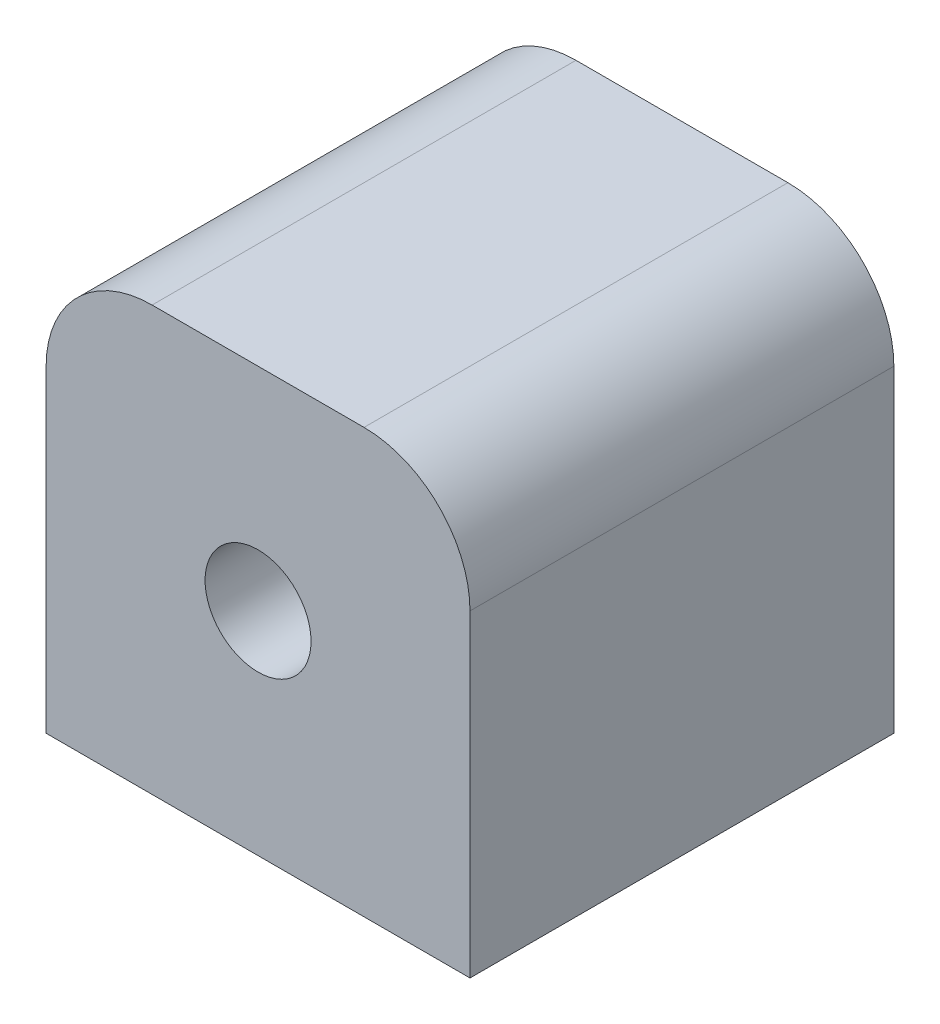
ISO-10303-21;
HEADER;
FILE_DESCRIPTION(('STEP AP214'),'2;1');
FILE_NAME('part.step','',(''),(''),'','','');
FILE_SCHEMA(('AUTOMOTIVE_DESIGN { 1 0 10303 214 1 1 1 1 }'));
ENDSEC;
DATA;
#1=APPLICATION_CONTEXT('core data for automotive mechanical design processes');
#2=APPLICATION_PROTOCOL_DEFINITION('international standard','automotive_design',2000,#1);
#3=PRODUCT_CONTEXT('',#1,'mechanical');
#4=PRODUCT('Part','Part','',(#3));
#5=PRODUCT_RELATED_PRODUCT_CATEGORY('part','',(#4));
#6=PRODUCT_DEFINITION_FORMATION('','',#4);
#7=PRODUCT_DEFINITION_CONTEXT('part definition',#1,'design');
#8=PRODUCT_DEFINITION('design','',#6,#7);
#9=PRODUCT_DEFINITION_SHAPE('','',#8);
#10=(LENGTH_UNIT() NAMED_UNIT(*) SI_UNIT(.MILLI.,.METRE.));
#11=(NAMED_UNIT(*) PLANE_ANGLE_UNIT() SI_UNIT($,.RADIAN.));
#12=(NAMED_UNIT(*) SI_UNIT($,.STERADIAN.) SOLID_ANGLE_UNIT());
#13=UNCERTAINTY_MEASURE_WITH_UNIT(LENGTH_MEASURE(1.E-05),#10,'distance_accuracy_value','');
#14=(GEOMETRIC_REPRESENTATION_CONTEXT(3) GLOBAL_UNCERTAINTY_ASSIGNED_CONTEXT((#13)) GLOBAL_UNIT_ASSIGNED_CONTEXT((#10,
#11,#12)) REPRESENTATION_CONTEXT('',''));
#15=CARTESIAN_POINT('',(0.,0.,0.));
#16=DIRECTION('',(0.,0.,1.));
#17=DIRECTION('',(1.,0.,0.));
#18=AXIS2_PLACEMENT_3D('',#15,#16,#17);
#19=CARTESIAN_POINT('',(20.,40.,-20.));
#20=DIRECTION('',(-1.,0.,0.));
#21=DIRECTION('',(0.,0.,1.));
#22=AXIS2_PLACEMENT_3D('',#19,#20,#21);
#23=PLANE('',#22);
#24=DIRECTION('',(0.,-1.,0.));
#25=VECTOR('',#24,1.);
#26=CARTESIAN_POINT('',(20.,40.,-20.));
#27=LINE('',#26,#25);
#28=CARTESIAN_POINT('',(20.,30.,-20.));
#29=VERTEX_POINT('',#28);
#30=CARTESIAN_POINT('',(20.,0.,-20.));
#31=VERTEX_POINT('',#30);
#32=EDGE_CURVE('E184',#29,#31,#27,.T.);
#33=ORIENTED_EDGE('',*,*,#32,.F.);
#34=DIRECTION('',(0.,0.,-1.));
#35=VECTOR('',#34,1.);
#36=CARTESIAN_POINT('',(20.,30.,20.));
#37=LINE('',#36,#35);
#38=CARTESIAN_POINT('',(20.,30.,20.));
#39=VERTEX_POINT('',#38);
#40=EDGE_CURVE('E11',#29,#39,#37,.F.);
#41=ORIENTED_EDGE('',*,*,#40,.T.);
#42=DIRECTION('',(0.,-1.,0.));
#43=VECTOR('',#42,1.);
#44=CARTESIAN_POINT('',(20.,40.,20.));
#45=LINE('',#44,#43);
#46=CARTESIAN_POINT('',(20.,0.,20.));
#47=VERTEX_POINT('',#46);
#48=EDGE_CURVE('E168',#39,#47,#45,.T.);
#49=ORIENTED_EDGE('',*,*,#48,.T.);
#50=DIRECTION('',(0.,0.,-1.));
#51=VECTOR('',#50,1.);
#52=CARTESIAN_POINT('',(20.,0.,-20.));
#53=LINE('',#52,#51);
#54=EDGE_CURVE('E158',#47,#31,#53,.T.);
#55=ORIENTED_EDGE('',*,*,#54,.T.);
#56=EDGE_LOOP('',(#33,#41,#49,#55));
#57=FACE_BOUND('',#56,.T.);
#58=ADVANCED_FACE('F47',(#57),#23,.F.);
#59=CARTESIAN_POINT('',(-20.,40.,-20.));
#60=DIRECTION('',(0.,0.,1.));
#61=DIRECTION('',(1.,0.,0.));
#62=AXIS2_PLACEMENT_3D('',#59,#60,#61);
#63=PLANE('',#62);
#64=CARTESIAN_POINT('',(0.,20.,-20.));
#65=DIRECTION('',(0.,0.,1.));
#66=DIRECTION('',(1.,0.,0.));
#67=AXIS2_PLACEMENT_3D('',#64,#65,#66);
#68=CIRCLE('',#67,5.);
#69=CARTESIAN_POINT('',(5.,20.,-20.));
#70=VERTEX_POINT('',#69);
#71=EDGE_CURVE('E155',#70,#70,#68,.T.);
#72=ORIENTED_EDGE('',*,*,#71,.T.);
#73=EDGE_LOOP('',(#72));
#74=FACE_BOUND('',#73,.T.);
#75=DIRECTION('',(0.,-1.,0.));
#76=VECTOR('',#75,1.);
#77=CARTESIAN_POINT('',(-20.,40.,-20.));
#78=LINE('',#77,#76);
#79=CARTESIAN_POINT('',(-20.,30.,-20.));
#80=VERTEX_POINT('',#79);
#81=CARTESIAN_POINT('',(-20.,0.,-20.));
#82=VERTEX_POINT('',#81);
#83=EDGE_CURVE('E182',#80,#82,#78,.T.);
#84=ORIENTED_EDGE('',*,*,#83,.F.);
#85=CARTESIAN_POINT('',(-10.,30.,-20.));
#86=DIRECTION('',(0.,0.,1.));
#87=DIRECTION('',(1.,0.,0.));
#88=AXIS2_PLACEMENT_3D('',#85,#86,#87);
#89=CIRCLE('',#88,10.);
#90=CARTESIAN_POINT('',(-10.,40.,-20.));
#91=VERTEX_POINT('',#90);
#92=EDGE_CURVE('E55',#80,#91,#89,.F.);
#93=ORIENTED_EDGE('',*,*,#92,.T.);
#94=DIRECTION('',(-1.,0.,0.));
#95=VECTOR('',#94,1.);
#96=CARTESIAN_POINT('',(-20.,40.,-20.));
#97=LINE('',#96,#95);
#98=CARTESIAN_POINT('',(10.,40.,-20.));
#99=VERTEX_POINT('',#98);
#100=EDGE_CURVE('E161',#99,#91,#97,.T.);
#101=ORIENTED_EDGE('',*,*,#100,.F.);
#102=CARTESIAN_POINT('',(10.,30.,-20.));
#103=DIRECTION('',(0.,0.,1.));
#104=DIRECTION('',(1.,0.,0.));
#105=AXIS2_PLACEMENT_3D('',#102,#103,#104);
#106=CIRCLE('',#105,10.);
#107=EDGE_CURVE('E62',#99,#29,#106,.F.);
#108=ORIENTED_EDGE('',*,*,#107,.T.);
#109=ORIENTED_EDGE('',*,*,#32,.T.);
#110=DIRECTION('',(-1.,0.,0.));
#111=VECTOR('',#110,1.);
#112=CARTESIAN_POINT('',(-20.,0.,-20.));
#113=LINE('',#112,#111);
#114=EDGE_CURVE('E171',#31,#82,#113,.T.);
#115=ORIENTED_EDGE('',*,*,#114,.T.);
#116=EDGE_LOOP('',(#84,#93,#101,#108,#109,#115));
#117=FACE_BOUND('',#116,.T.);
#118=ADVANCED_FACE('F198',(#74,#117),#63,.F.);
#119=CARTESIAN_POINT('',(-20.,40.,-20.));
#120=DIRECTION('',(1.,0.,0.));
#121=DIRECTION('',(0.,0.,-1.));
#122=AXIS2_PLACEMENT_3D('',#119,#120,#121);
#123=PLANE('',#122);
#124=DIRECTION('',(0.,-1.,0.));
#125=VECTOR('',#124,1.);
#126=CARTESIAN_POINT('',(-20.,40.,20.));
#127=LINE('',#126,#125);
#128=CARTESIAN_POINT('',(-20.,30.,20.));
#129=VERTEX_POINT('',#128);
#130=CARTESIAN_POINT('',(-20.,0.,20.));
#131=VERTEX_POINT('',#130);
#132=EDGE_CURVE('E180',#129,#131,#127,.T.);
#133=ORIENTED_EDGE('',*,*,#132,.F.);
#134=DIRECTION('',(0.,0.,1.));
#135=VECTOR('',#134,1.);
#136=CARTESIAN_POINT('',(-20.,30.,-20.));
#137=LINE('',#136,#135);
#138=EDGE_CURVE('E70',#129,#80,#137,.F.);
#139=ORIENTED_EDGE('',*,*,#138,.T.);
#140=ORIENTED_EDGE('',*,*,#83,.T.);
#141=DIRECTION('',(0.,0.,1.));
#142=VECTOR('',#141,1.);
#143=CARTESIAN_POINT('',(-20.,0.,-20.));
#144=LINE('',#143,#142);
#145=EDGE_CURVE('E174',#82,#131,#144,.T.);
#146=ORIENTED_EDGE('',*,*,#145,.T.);
#147=EDGE_LOOP('',(#133,#139,#140,#146));
#148=FACE_BOUND('',#147,.T.);
#149=ADVANCED_FACE('F208',(#148),#123,.F.);
#150=CARTESIAN_POINT('',(-20.,40.,20.));
#151=DIRECTION('',(0.,0.,-1.));
#152=DIRECTION('',(-1.,0.,0.));
#153=AXIS2_PLACEMENT_3D('',#150,#151,#152);
#154=PLANE('',#153);
#155=CARTESIAN_POINT('',(0.,20.,20.));
#156=DIRECTION('',(0.,0.,1.));
#157=DIRECTION('',(1.,0.,0.));
#158=AXIS2_PLACEMENT_3D('',#155,#156,#157);
#159=CIRCLE('',#158,5.);
#160=CARTESIAN_POINT('',(5.,20.,20.));
#161=VERTEX_POINT('',#160);
#162=EDGE_CURVE('E154',#161,#161,#159,.T.);
#163=ORIENTED_EDGE('',*,*,#162,.F.);
#164=EDGE_LOOP('',(#163));
#165=FACE_BOUND('',#164,.T.);
#166=DIRECTION('',(1.,0.,0.));
#167=VECTOR('',#166,1.);
#168=CARTESIAN_POINT('',(-20.,40.,20.));
#169=LINE('',#168,#167);
#170=CARTESIAN_POINT('',(-9.99999999999998,40.,20.));
#171=VERTEX_POINT('',#170);
#172=CARTESIAN_POINT('',(10.,40.,20.));
#173=VERTEX_POINT('',#172);
#174=EDGE_CURVE('E164',#171,#173,#169,.T.);
#175=ORIENTED_EDGE('',*,*,#174,.F.);
#176=CARTESIAN_POINT('',(-9.99999999999998,30.,20.));
#177=DIRECTION('',(0.,0.,-1.));
#178=DIRECTION('',(-1.,0.,0.));
#179=AXIS2_PLACEMENT_3D('',#176,#177,#178);
#180=CIRCLE('',#179,10.);
#181=EDGE_CURVE('E194',#171,#129,#180,.F.);
#182=ORIENTED_EDGE('',*,*,#181,.T.);
#183=ORIENTED_EDGE('',*,*,#132,.T.);
#184=DIRECTION('',(1.,0.,0.));
#185=VECTOR('',#184,1.);
#186=CARTESIAN_POINT('',(-20.,0.,20.));
#187=LINE('',#186,#185);
#188=EDGE_CURVE('E165',#131,#47,#187,.T.);
#189=ORIENTED_EDGE('',*,*,#188,.T.);
#190=ORIENTED_EDGE('',*,*,#48,.F.);
#191=CARTESIAN_POINT('',(10.,30.,20.));
#192=DIRECTION('',(0.,0.,-1.));
#193=DIRECTION('',(-1.,0.,0.));
#194=AXIS2_PLACEMENT_3D('',#191,#192,#193);
#195=CIRCLE('',#194,10.);
#196=EDGE_CURVE('E192',#39,#173,#195,.F.);
#197=ORIENTED_EDGE('',*,*,#196,.T.);
#198=EDGE_LOOP('',(#175,#182,#183,#189,#190,#197));
#199=FACE_BOUND('',#198,.T.);
#200=ADVANCED_FACE('F207',(#165,#199),#154,.F.);
#201=CARTESIAN_POINT('',(0.,40.,0.));
#202=DIRECTION('',(0.,1.,0.));
#203=DIRECTION('',(0.,0.,1.));
#204=AXIS2_PLACEMENT_3D('',#201,#202,#203);
#205=PLANE('',#204);
#206=ORIENTED_EDGE('',*,*,#100,.T.);
#207=DIRECTION('',(0.,0.,1.));
#208=VECTOR('',#207,1.);
#209=CARTESIAN_POINT('',(-9.99999999999998,40.,20.));
#210=LINE('',#209,#208);
#211=EDGE_CURVE('E189',#91,#171,#210,.T.);
#212=ORIENTED_EDGE('',*,*,#211,.T.);
#213=ORIENTED_EDGE('',*,*,#174,.T.);
#214=DIRECTION('',(0.,0.,-1.));
#215=VECTOR('',#214,1.);
#216=CARTESIAN_POINT('',(10.,40.,-20.));
#217=LINE('',#216,#215);
#218=EDGE_CURVE('E186',#173,#99,#217,.T.);
#219=ORIENTED_EDGE('',*,*,#218,.T.);
#220=EDGE_LOOP('',(#206,#212,#213,#219));
#221=FACE_BOUND('',#220,.T.);
#222=ADVANCED_FACE('F202',(#221),#205,.T.);
#223=CARTESIAN_POINT('',(0.,0.,0.));
#224=DIRECTION('',(0.,1.,0.));
#225=DIRECTION('',(0.,0.,1.));
#226=AXIS2_PLACEMENT_3D('',#223,#224,#225);
#227=PLANE('',#226);
#228=CARTESIAN_POINT('',(0.,0.,0.));
#229=DIRECTION('',(0.,-1.,0.));
#230=DIRECTION('',(0.,0.,-1.));
#231=AXIS2_PLACEMENT_3D('',#228,#229,#230);
#232=CIRCLE('',#231,5.);
#233=CARTESIAN_POINT('',(0.,0.,-5.));
#234=VERTEX_POINT('',#233);
#235=EDGE_CURVE('E505',#234,#234,#232,.T.);
#236=ORIENTED_EDGE('',*,*,#235,.F.);
#237=EDGE_LOOP('',(#236));
#238=FACE_BOUND('',#237,.T.);
#239=CARTESIAN_POINT('',(10.,0.,-10.));
#240=DIRECTION('',(0.,-1.,0.));
#241=DIRECTION('',(0.,0.,-1.));
#242=AXIS2_PLACEMENT_3D('',#239,#240,#241);
#243=CIRCLE('',#242,3.575);
#244=CARTESIAN_POINT('',(10.,0.,-13.575));
#245=VERTEX_POINT('',#244);
#246=EDGE_CURVE('E127',#245,#245,#243,.T.);
#247=ORIENTED_EDGE('',*,*,#246,.F.);
#248=EDGE_LOOP('',(#247));
#249=FACE_BOUND('',#248,.T.);
#250=CARTESIAN_POINT('',(-10.,0.,-10.));
#251=DIRECTION('',(0.,-1.,0.));
#252=DIRECTION('',(0.,0.,-1.));
#253=AXIS2_PLACEMENT_3D('',#250,#251,#252);
#254=CIRCLE('',#253,3.575);
#255=CARTESIAN_POINT('',(-10.,0.,-13.575));
#256=VERTEX_POINT('',#255);
#257=EDGE_CURVE('E120',#256,#256,#254,.T.);
#258=ORIENTED_EDGE('',*,*,#257,.F.);
#259=EDGE_LOOP('',(#258));
#260=FACE_BOUND('',#259,.T.);
#261=CARTESIAN_POINT('',(10.,0.,10.));
#262=DIRECTION('',(0.,-1.,0.));
#263=DIRECTION('',(0.,0.,-1.));
#264=AXIS2_PLACEMENT_3D('',#261,#262,#263);
#265=CIRCLE('',#264,3.575);
#266=CARTESIAN_POINT('',(10.,0.,6.425));
#267=VERTEX_POINT('',#266);
#268=EDGE_CURVE('E136',#267,#267,#265,.T.);
#269=ORIENTED_EDGE('',*,*,#268,.F.);
#270=EDGE_LOOP('',(#269));
#271=FACE_BOUND('',#270,.T.);
#272=CARTESIAN_POINT('',(-10.,0.,10.));
#273=DIRECTION('',(0.,-1.,0.));
#274=DIRECTION('',(0.,0.,-1.));
#275=AXIS2_PLACEMENT_3D('',#272,#273,#274);
#276=CIRCLE('',#275,3.575);
#277=CARTESIAN_POINT('',(-10.,0.,6.425));
#278=VERTEX_POINT('',#277);
#279=EDGE_CURVE('E145',#278,#278,#276,.T.);
#280=ORIENTED_EDGE('',*,*,#279,.F.);
#281=EDGE_LOOP('',(#280));
#282=FACE_BOUND('',#281,.T.);
#283=ORIENTED_EDGE('',*,*,#54,.F.);
#284=ORIENTED_EDGE('',*,*,#188,.F.);
#285=ORIENTED_EDGE('',*,*,#145,.F.);
#286=ORIENTED_EDGE('',*,*,#114,.F.);
#287=EDGE_LOOP('',(#283,#284,#285,#286));
#288=FACE_BOUND('',#287,.T.);
#289=ADVANCED_FACE('F214',(#238,#249,#260,#271,#282,#288),#227,.F.);
#290=CARTESIAN_POINT('',(0.,20.,-20.));
#291=DIRECTION('',(0.,0.,1.));
#292=DIRECTION('',(1.,0.,0.));
#293=AXIS2_PLACEMENT_3D('',#290,#291,#292);
#294=CYLINDRICAL_SURFACE('',#293,5.);
#295=ORIENTED_EDGE('',*,*,#71,.F.);
#296=EDGE_LOOP('',(#295));
#297=FACE_BOUND('',#296,.T.);
#298=ORIENTED_EDGE('',*,*,#162,.T.);
#299=EDGE_LOOP('',(#298));
#300=FACE_BOUND('',#299,.T.);
#301=ADVANCED_FACE('F229',(#297,#300),#294,.F.);
#302=CARTESIAN_POINT('',(-9.99999999999999,30.,0.));
#303=DIRECTION('',(0.,0.,-1.));
#304=DIRECTION('',(-1.,0.,0.));
#305=AXIS2_PLACEMENT_3D('',#302,#303,#304);
#306=CYLINDRICAL_SURFACE('',#305,10.);
#307=ORIENTED_EDGE('',*,*,#92,.F.);
#308=ORIENTED_EDGE('',*,*,#138,.F.);
#309=ORIENTED_EDGE('',*,*,#181,.F.);
#310=ORIENTED_EDGE('',*,*,#211,.F.);
#311=EDGE_LOOP('',(#307,#308,#309,#310));
#312=FACE_BOUND('',#311,.T.);
#313=ADVANCED_FACE('F205',(#312),#306,.T.);
#314=CARTESIAN_POINT('',(10.,30.,0.));
#315=DIRECTION('',(0.,0.,1.));
#316=DIRECTION('',(1.,0.,0.));
#317=AXIS2_PLACEMENT_3D('',#314,#315,#316);
#318=CYLINDRICAL_SURFACE('',#317,10.);
#319=ORIENTED_EDGE('',*,*,#196,.F.);
#320=ORIENTED_EDGE('',*,*,#40,.F.);
#321=ORIENTED_EDGE('',*,*,#107,.F.);
#322=ORIENTED_EDGE('',*,*,#218,.F.);
#323=EDGE_LOOP('',(#319,#320,#321,#322));
#324=FACE_BOUND('',#323,.T.);
#325=ADVANCED_FACE('F49',(#324),#318,.T.);
#326=CARTESIAN_POINT('',(-10.,10.,10.));
#327=DIRECTION('',(0.,-1.,0.));
#328=DIRECTION('',(0.,0.,-1.));
#329=AXIS2_PLACEMENT_3D('',#326,#327,#328);
#330=CONICAL_SURFACE('',#329,3.54999999999999,1.02974425867665);
#331=CARTESIAN_POINT('',(-10.,12.1330551975478,10.));
#332=VERTEX_POINT('',#331);
#333=VERTEX_LOOP('',#332);
#334=FACE_BOUND('',#333,.T.);
#335=CARTESIAN_POINT('',(-10.,10.,10.));
#336=DIRECTION('',(0.,-1.,0.));
#337=DIRECTION('',(0.,0.,-1.));
#338=AXIS2_PLACEMENT_3D('',#335,#336,#337);
#339=CIRCLE('',#338,3.54999999999999);
#340=CARTESIAN_POINT('',(-10.,10.,6.45000000000001));
#341=VERTEX_POINT('',#340);
#342=EDGE_CURVE('E151',#341,#341,#339,.T.);
#343=ORIENTED_EDGE('',*,*,#342,.T.);
#344=EDGE_LOOP('',(#343));
#345=FACE_BOUND('',#344,.T.);
#346=ADVANCED_FACE('F234',(#334,#345),#330,.F.);
#347=CARTESIAN_POINT('',(-10.,0.,10.));
#348=DIRECTION('',(0.,-1.,0.));
#349=DIRECTION('',(0.,0.,-1.));
#350=AXIS2_PLACEMENT_3D('',#347,#348,#349);
#351=CYLINDRICAL_SURFACE('',#350,3.54999999999999);
#352=ORIENTED_EDGE('',*,*,#342,.F.);
#353=EDGE_LOOP('',(#352));
#354=FACE_BOUND('',#353,.T.);
#355=CARTESIAN_POINT('',(-10.,0.0209774907794363,10.));
#356=DIRECTION('',(0.,-1.,0.));
#357=DIRECTION('',(0.,0.,-1.));
#358=AXIS2_PLACEMENT_3D('',#355,#356,#357);
#359=CIRCLE('',#358,3.54999999999999);
#360=CARTESIAN_POINT('',(-10.,0.0209774907794363,6.45000000000001));
#361=VERTEX_POINT('',#360);
#362=EDGE_CURVE('E148',#361,#361,#359,.T.);
#363=ORIENTED_EDGE('',*,*,#362,.T.);
#364=EDGE_LOOP('',(#363));
#365=FACE_BOUND('',#364,.T.);
#366=ADVANCED_FACE('F388',(#354,#365),#351,.F.);
#367=CARTESIAN_POINT('',(-10.,0.,10.));
#368=DIRECTION('',(0.,-1.,0.));
#369=DIRECTION('',(0.,0.,-1.));
#370=AXIS2_PLACEMENT_3D('',#367,#368,#369);
#371=CONICAL_SURFACE('',#370,3.575,0.872664625997122);
#372=ORIENTED_EDGE('',*,*,#362,.F.);
#373=EDGE_LOOP('',(#372));
#374=FACE_BOUND('',#373,.T.);
#375=ORIENTED_EDGE('',*,*,#279,.T.);
#376=EDGE_LOOP('',(#375));
#377=FACE_BOUND('',#376,.T.);
#378=ADVANCED_FACE('F378',(#374,#377),#371,.F.);
#379=CARTESIAN_POINT('',(10.,10.,10.));
#380=DIRECTION('',(0.,-1.,0.));
#381=DIRECTION('',(0.,0.,-1.));
#382=AXIS2_PLACEMENT_3D('',#379,#380,#381);
#383=CONICAL_SURFACE('',#382,3.54999999999999,1.02974425867665);
#384=CARTESIAN_POINT('',(9.99999999999999,12.1330551975478,10.));
#385=VERTEX_POINT('',#384);
#386=VERTEX_LOOP('',#385);
#387=FACE_BOUND('',#386,.T.);
#388=CARTESIAN_POINT('',(10.,10.,10.));
#389=DIRECTION('',(0.,-1.,0.));
#390=DIRECTION('',(0.,0.,-1.));
#391=AXIS2_PLACEMENT_3D('',#388,#389,#390);
#392=CIRCLE('',#391,3.54999999999999);
#393=CARTESIAN_POINT('',(10.,10.,6.45000000000001));
#394=VERTEX_POINT('',#393);
#395=EDGE_CURVE('E142',#394,#394,#392,.T.);
#396=ORIENTED_EDGE('',*,*,#395,.T.);
#397=EDGE_LOOP('',(#396));
#398=FACE_BOUND('',#397,.T.);
#399=ADVANCED_FACE('F368',(#387,#398),#383,.F.);
#400=CARTESIAN_POINT('',(10.,0.,10.));
#401=DIRECTION('',(0.,-1.,0.));
#402=DIRECTION('',(0.,0.,-1.));
#403=AXIS2_PLACEMENT_3D('',#400,#401,#402);
#404=CYLINDRICAL_SURFACE('',#403,3.54999999999999);
#405=ORIENTED_EDGE('',*,*,#395,.F.);
#406=EDGE_LOOP('',(#405));
#407=FACE_BOUND('',#406,.T.);
#408=CARTESIAN_POINT('',(10.,0.0209774907794363,10.));
#409=DIRECTION('',(0.,-1.,0.));
#410=DIRECTION('',(0.,0.,-1.));
#411=AXIS2_PLACEMENT_3D('',#408,#409,#410);
#412=CIRCLE('',#411,3.54999999999999);
#413=CARTESIAN_POINT('',(10.,0.0209774907794363,6.45000000000001));
#414=VERTEX_POINT('',#413);
#415=EDGE_CURVE('E139',#414,#414,#412,.T.);
#416=ORIENTED_EDGE('',*,*,#415,.T.);
#417=EDGE_LOOP('',(#416));
#418=FACE_BOUND('',#417,.T.);
#419=ADVANCED_FACE('F358',(#407,#418),#404,.F.);
#420=CARTESIAN_POINT('',(10.,0.,10.));
#421=DIRECTION('',(0.,-1.,0.));
#422=DIRECTION('',(0.,0.,-1.));
#423=AXIS2_PLACEMENT_3D('',#420,#421,#422);
#424=CONICAL_SURFACE('',#423,3.575,0.872664625997139);
#425=ORIENTED_EDGE('',*,*,#415,.F.);
#426=EDGE_LOOP('',(#425));
#427=FACE_BOUND('',#426,.T.);
#428=ORIENTED_EDGE('',*,*,#268,.T.);
#429=EDGE_LOOP('',(#428));
#430=FACE_BOUND('',#429,.T.);
#431=ADVANCED_FACE('F348',(#427,#430),#424,.F.);
#432=CARTESIAN_POINT('',(-10.,10.,-10.));
#433=DIRECTION('',(0.,-1.,0.));
#434=DIRECTION('',(0.,0.,-1.));
#435=AXIS2_PLACEMENT_3D('',#432,#433,#434);
#436=CONICAL_SURFACE('',#435,3.54999999999999,1.02974425867665);
#437=CARTESIAN_POINT('',(-10.,12.1330551975478,-10.));
#438=VERTEX_POINT('',#437);
#439=VERTEX_LOOP('',#438);
#440=FACE_BOUND('',#439,.T.);
#441=CARTESIAN_POINT('',(-10.,10.,-10.));
#442=DIRECTION('',(0.,-1.,0.));
#443=DIRECTION('',(0.,0.,-1.));
#444=AXIS2_PLACEMENT_3D('',#441,#442,#443);
#445=CIRCLE('',#444,3.54999999999999);
#446=CARTESIAN_POINT('',(-10.,10.,-13.55));
#447=VERTEX_POINT('',#446);
#448=EDGE_CURVE('E133',#447,#447,#445,.T.);
#449=ORIENTED_EDGE('',*,*,#448,.T.);
#450=EDGE_LOOP('',(#449));
#451=FACE_BOUND('',#450,.T.);
#452=ADVANCED_FACE('F338',(#440,#451),#436,.F.);
#453=CARTESIAN_POINT('',(-10.,0.,-10.));
#454=DIRECTION('',(0.,-1.,0.));
#455=DIRECTION('',(0.,0.,-1.));
#456=AXIS2_PLACEMENT_3D('',#453,#454,#455);
#457=CYLINDRICAL_SURFACE('',#456,3.54999999999999);
#458=ORIENTED_EDGE('',*,*,#448,.F.);
#459=EDGE_LOOP('',(#458));
#460=FACE_BOUND('',#459,.T.);
#461=CARTESIAN_POINT('',(-10.,0.0209774907794363,-10.));
#462=DIRECTION('',(0.,-1.,0.));
#463=DIRECTION('',(0.,0.,-1.));
#464=AXIS2_PLACEMENT_3D('',#461,#462,#463);
#465=CIRCLE('',#464,3.54999999999999);
#466=CARTESIAN_POINT('',(-10.,0.0209774907794363,-13.55));
#467=VERTEX_POINT('',#466);
#468=EDGE_CURVE('E124',#467,#467,#465,.T.);
#469=ORIENTED_EDGE('',*,*,#468,.T.);
#470=EDGE_LOOP('',(#469));
#471=FACE_BOUND('',#470,.T.);
#472=ADVANCED_FACE('F328',(#460,#471),#457,.F.);
#473=CARTESIAN_POINT('',(-10.,0.,-10.));
#474=DIRECTION('',(0.,-1.,0.));
#475=DIRECTION('',(0.,0.,-1.));
#476=AXIS2_PLACEMENT_3D('',#473,#474,#475);
#477=CONICAL_SURFACE('',#476,3.575,0.872664625997122);
#478=ORIENTED_EDGE('',*,*,#468,.F.);
#479=EDGE_LOOP('',(#478));
#480=FACE_BOUND('',#479,.T.);
#481=ORIENTED_EDGE('',*,*,#257,.T.);
#482=EDGE_LOOP('',(#481));
#483=FACE_BOUND('',#482,.T.);
#484=ADVANCED_FACE('F114',(#480,#483),#477,.F.);
#485=CARTESIAN_POINT('',(10.,10.,-10.));
#486=DIRECTION('',(0.,-1.,0.));
#487=DIRECTION('',(0.,0.,-1.));
#488=AXIS2_PLACEMENT_3D('',#485,#486,#487);
#489=CONICAL_SURFACE('',#488,3.54999999999999,1.02974425867665);
#490=CARTESIAN_POINT('',(10.,12.1330551975478,-10.));
#491=VERTEX_POINT('',#490);
#492=VERTEX_LOOP('',#491);
#493=FACE_BOUND('',#492,.T.);
#494=CARTESIAN_POINT('',(10.,10.,-10.));
#495=DIRECTION('',(0.,-1.,0.));
#496=DIRECTION('',(0.,0.,-1.));
#497=AXIS2_PLACEMENT_3D('',#494,#495,#496);
#498=CIRCLE('',#497,3.54999999999999);
#499=CARTESIAN_POINT('',(10.,10.,-13.55));
#500=VERTEX_POINT('',#499);
#501=EDGE_CURVE('E118',#500,#500,#498,.T.);
#502=ORIENTED_EDGE('',*,*,#501,.T.);
#503=EDGE_LOOP('',(#502));
#504=FACE_BOUND('',#503,.T.);
#505=ADVANCED_FACE('F110',(#493,#504),#489,.F.);
#506=CARTESIAN_POINT('',(10.,0.,-10.));
#507=DIRECTION('',(0.,-1.,0.));
#508=DIRECTION('',(0.,0.,-1.));
#509=AXIS2_PLACEMENT_3D('',#506,#507,#508);
#510=CYLINDRICAL_SURFACE('',#509,3.54999999999999);
#511=ORIENTED_EDGE('',*,*,#501,.F.);
#512=EDGE_LOOP('',(#511));
#513=FACE_BOUND('',#512,.T.);
#514=CARTESIAN_POINT('',(10.,0.0209774907794363,-10.));
#515=DIRECTION('',(0.,-1.,0.));
#516=DIRECTION('',(0.,0.,-1.));
#517=AXIS2_PLACEMENT_3D('',#514,#515,#516);
#518=CIRCLE('',#517,3.55);
#519=CARTESIAN_POINT('',(10.,0.0209774907794363,-13.55));
#520=VERTEX_POINT('',#519);
#521=EDGE_CURVE('E121',#520,#520,#518,.T.);
#522=ORIENTED_EDGE('',*,*,#521,.T.);
#523=EDGE_LOOP('',(#522));
#524=FACE_BOUND('',#523,.T.);
#525=ADVANCED_FACE('F113',(#513,#524),#510,.F.);
#526=CARTESIAN_POINT('',(10.,0.,-10.));
#527=DIRECTION('',(0.,-1.,0.));
#528=DIRECTION('',(0.,0.,-1.));
#529=AXIS2_PLACEMENT_3D('',#526,#527,#528);
#530=CONICAL_SURFACE('',#529,3.575,0.872664625997105);
#531=ORIENTED_EDGE('',*,*,#521,.F.);
#532=EDGE_LOOP('',(#531));
#533=FACE_BOUND('',#532,.T.);
#534=ORIENTED_EDGE('',*,*,#246,.T.);
#535=EDGE_LOOP('',(#534));
#536=FACE_BOUND('',#535,.T.);
#537=ADVANCED_FACE('F276',(#533,#536),#530,.F.);
#538=CARTESIAN_POINT('',(0.,10.,0.));
#539=DIRECTION('',(0.,-1.,0.));
#540=DIRECTION('',(0.,0.,-1.));
#541=AXIS2_PLACEMENT_3D('',#538,#539,#540);
#542=CYLINDRICAL_SURFACE('',#541,5.);
#543=CARTESIAN_POINT('',(0.,10.,0.));
#544=DIRECTION('',(0.,-1.,0.));
#545=DIRECTION('',(0.,0.,-1.));
#546=AXIS2_PLACEMENT_3D('',#543,#544,#545);
#547=CIRCLE('',#546,5.);
#548=CARTESIAN_POINT('',(0.,10.,-5.));
#549=VERTEX_POINT('',#548);
#550=EDGE_CURVE('E503',#549,#549,#547,.T.);
#551=ORIENTED_EDGE('',*,*,#550,.F.);
#552=EDGE_LOOP('',(#551));
#553=FACE_BOUND('',#552,.T.);
#554=ORIENTED_EDGE('',*,*,#235,.T.);
#555=EDGE_LOOP('',(#554));
#556=FACE_BOUND('',#555,.T.);
#557=ADVANCED_FACE('F281',(#553,#556),#542,.F.);
#558=CARTESIAN_POINT('',(0.,10.,0.));
#559=DIRECTION('',(0.,-1.,0.));
#560=DIRECTION('',(0.,0.,-1.));
#561=AXIS2_PLACEMENT_3D('',#558,#559,#560);
#562=PLANE('',#561);
#563=ORIENTED_EDGE('',*,*,#550,.T.);
#564=EDGE_LOOP('',(#563));
#565=FACE_BOUND('',#564,.T.);
#566=ADVANCED_FACE('F286',(#565),#562,.T.);
#567=CLOSED_SHELL('',(#58,#118,#149,#200,#222,#289,#301,#313,#325,#346,#366,#378,#399,#419,#431,
#452,#472,#484,#505,#525,#537,#557,#566));
#568=MANIFOLD_SOLID_BREP('B2',#567);
#569=ADVANCED_BREP_SHAPE_REPRESENTATION('',(#18,#568),#14);
#570=SHAPE_DEFINITION_REPRESENTATION(#9,#569);
ENDSEC;
END-ISO-10303-21;
